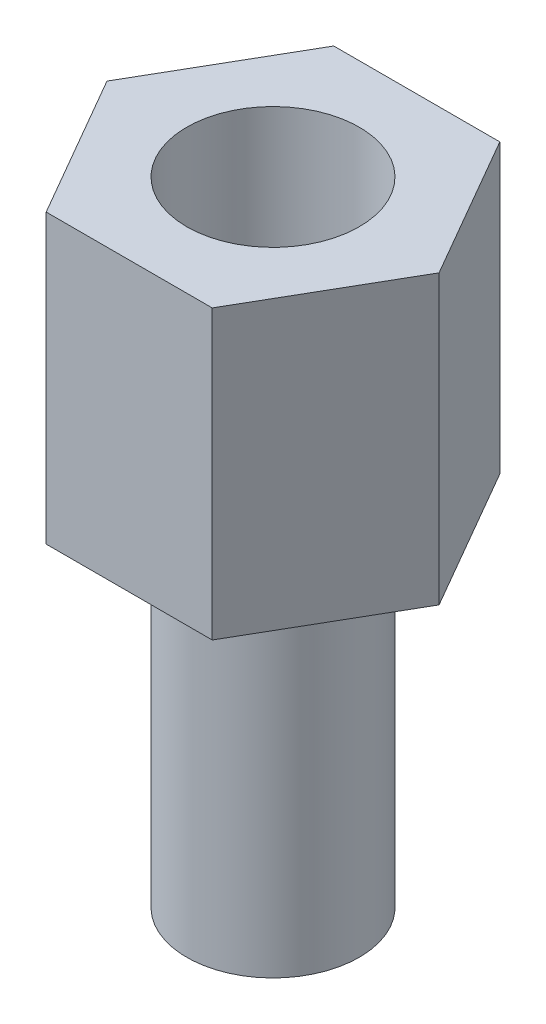
ISO-10303-21;
HEADER;
FILE_DESCRIPTION(('STEP AP214'),'2;1');
FILE_NAME('part.step','',(''),(''),'','','');
FILE_SCHEMA(('AUTOMOTIVE_DESIGN { 1 0 10303 214 1 1 1 1 }'));
ENDSEC;
DATA;
#1=APPLICATION_CONTEXT('core data for automotive mechanical design processes');
#2=APPLICATION_PROTOCOL_DEFINITION('international standard','automotive_design',2000,#1);
#3=PRODUCT_CONTEXT('',#1,'mechanical');
#4=PRODUCT('Part','Part','',(#3));
#5=PRODUCT_RELATED_PRODUCT_CATEGORY('part','',(#4));
#6=PRODUCT_DEFINITION_FORMATION('','',#4);
#7=PRODUCT_DEFINITION_CONTEXT('part definition',#1,'design');
#8=PRODUCT_DEFINITION('design','',#6,#7);
#9=PRODUCT_DEFINITION_SHAPE('','',#8);
#10=(LENGTH_UNIT() NAMED_UNIT(*) SI_UNIT(.MILLI.,.METRE.));
#11=(NAMED_UNIT(*) PLANE_ANGLE_UNIT() SI_UNIT($,.RADIAN.));
#12=(NAMED_UNIT(*) SI_UNIT($,.STERADIAN.) SOLID_ANGLE_UNIT());
#13=UNCERTAINTY_MEASURE_WITH_UNIT(LENGTH_MEASURE(1.E-05),#10,'distance_accuracy_value','');
#14=(GEOMETRIC_REPRESENTATION_CONTEXT(3) GLOBAL_UNCERTAINTY_ASSIGNED_CONTEXT((#13)) GLOBAL_UNIT_ASSIGNED_CONTEXT((#10,
#11,#12)) REPRESENTATION_CONTEXT('',''));
#15=CARTESIAN_POINT('',(0.,0.,0.));
#16=DIRECTION('',(0.,0.,1.));
#17=DIRECTION('',(1.,0.,0.));
#18=AXIS2_PLACEMENT_3D('',#15,#16,#17);
#19=CARTESIAN_POINT('',(0.,-6.,0.));
#20=DIRECTION('',(0.,1.,0.));
#21=DIRECTION('',(0.,0.,1.));
#22=AXIS2_PLACEMENT_3D('',#19,#20,#21);
#23=CYLINDRICAL_SURFACE('',#22,1.5);
#24=CARTESIAN_POINT('',(0.,-6.,0.));
#25=DIRECTION('',(0.,-1.,0.));
#26=DIRECTION('',(0.,0.,-1.));
#27=AXIS2_PLACEMENT_3D('',#24,#25,#26);
#28=CIRCLE('',#27,1.5);
#29=CARTESIAN_POINT('',(0.,-6.,-1.5));
#30=VERTEX_POINT('',#29);
#31=EDGE_CURVE('E11',#30,#30,#28,.T.);
#32=ORIENTED_EDGE('',*,*,#31,.F.);
#33=EDGE_LOOP('',(#32));
#34=FACE_BOUND('',#33,.T.);
#35=CARTESIAN_POINT('',(0.,0.,0.));
#36=DIRECTION('',(0.,-1.,0.));
#37=DIRECTION('',(0.,0.,-1.));
#38=AXIS2_PLACEMENT_3D('',#35,#36,#37);
#39=CIRCLE('',#38,1.5);
#40=CARTESIAN_POINT('',(0.,0.,-1.5));
#41=VERTEX_POINT('',#40);
#42=EDGE_CURVE('E44',#41,#41,#39,.T.);
#43=ORIENTED_EDGE('',*,*,#42,.T.);
#44=EDGE_LOOP('',(#43));
#45=FACE_BOUND('',#44,.T.);
#46=ADVANCED_FACE('F41',(#34,#45),#23,.T.);
#47=CARTESIAN_POINT('',(0.,-6.,0.));
#48=DIRECTION('',(0.,-1.,0.));
#49=DIRECTION('',(0.,0.,-1.));
#50=AXIS2_PLACEMENT_3D('',#47,#48,#49);
#51=PLANE('',#50);
#52=ORIENTED_EDGE('',*,*,#31,.T.);
#53=EDGE_LOOP('',(#52));
#54=FACE_BOUND('',#53,.T.);
#55=ADVANCED_FACE('F56',(#54),#51,.T.);
#56=CARTESIAN_POINT('',(0.,0.,0.));
#57=DIRECTION('',(0.,-1.,0.));
#58=DIRECTION('',(0.,0.,-1.));
#59=AXIS2_PLACEMENT_3D('',#56,#57,#58);
#60=PLANE('',#59);
#61=ORIENTED_EDGE('',*,*,#42,.F.);
#62=EDGE_LOOP('',(#61));
#63=FACE_BOUND('',#62,.T.);
#64=ADVANCED_FACE('F54',(#63),#60,.F.);
#65=CLOSED_SHELL('',(#46,#55,#64));
#66=MANIFOLD_SOLID_BREP('B2',#65);
#67=CARTESIAN_POINT('',(0.,5.,0.));
#68=DIRECTION('',(0.,1.,0.));
#69=DIRECTION('',(0.,0.,1.));
#70=AXIS2_PLACEMENT_3D('',#67,#68,#69);
#71=PLANE('',#70);
#72=DIRECTION('',(1.,0.,0.));
#73=VECTOR('',#72,1.);
#74=CARTESIAN_POINT('',(-1.44337567297405,5.,2.5));
#75=LINE('',#74,#73);
#76=CARTESIAN_POINT('',(-1.44337567297405,5.,2.5));
#77=VERTEX_POINT('',#76);
#78=CARTESIAN_POINT('',(1.44337567297408,5.,2.5));
#79=VERTEX_POINT('',#78);
#80=EDGE_CURVE('E178',#77,#79,#75,.T.);
#81=ORIENTED_EDGE('',*,*,#80,.T.);
#82=DIRECTION('',(0.500000000000001,0.,-0.866025403784438));
#83=VECTOR('',#82,1.);
#84=CARTESIAN_POINT('',(1.44337567297408,5.,2.5));
#85=LINE('',#84,#83);
#86=CARTESIAN_POINT('',(2.88675134594815,5.,0.));
#87=VERTEX_POINT('',#86);
#88=EDGE_CURVE('E136',#79,#87,#85,.T.);
#89=ORIENTED_EDGE('',*,*,#88,.T.);
#90=DIRECTION('',(-0.500000000000001,0.,-0.866025403784438));
#91=VECTOR('',#90,1.);
#92=CARTESIAN_POINT('',(2.88675134594815,5.,0.));
#93=LINE('',#92,#91);
#94=CARTESIAN_POINT('',(1.44337567297408,5.,-2.50000000000001));
#95=VERTEX_POINT('',#94);
#96=EDGE_CURVE('E149',#87,#95,#93,.T.);
#97=ORIENTED_EDGE('',*,*,#96,.T.);
#98=DIRECTION('',(-1.,0.,0.));
#99=VECTOR('',#98,1.);
#100=CARTESIAN_POINT('',(1.44337567297408,5.,-2.50000000000001));
#101=LINE('',#100,#99);
#102=CARTESIAN_POINT('',(-1.44337567297405,5.,-2.50000000000001));
#103=VERTEX_POINT('',#102);
#104=EDGE_CURVE('E143',#95,#103,#101,.T.);
#105=ORIENTED_EDGE('',*,*,#104,.T.);
#106=DIRECTION('',(-0.5,0.,0.866025403784438));
#107=VECTOR('',#106,1.);
#108=CARTESIAN_POINT('',(-1.44337567297405,5.,-2.50000000000001));
#109=LINE('',#108,#107);
#110=CARTESIAN_POINT('',(-2.88675134594812,5.,0.));
#111=VERTEX_POINT('',#110);
#112=EDGE_CURVE('E147',#103,#111,#109,.T.);
#113=ORIENTED_EDGE('',*,*,#112,.T.);
#114=DIRECTION('',(0.5,0.,0.866025403784438));
#115=VECTOR('',#114,1.);
#116=CARTESIAN_POINT('',(-2.88675134594812,5.,0.));
#117=LINE('',#116,#115);
#118=EDGE_CURVE('E99',#111,#77,#117,.T.);
#119=ORIENTED_EDGE('',*,*,#118,.T.);
#120=EDGE_LOOP('',(#81,#89,#97,#105,#113,#119));
#121=FACE_BOUND('',#120,.T.);
#122=CARTESIAN_POINT('',(0.,5.,0.));
#123=DIRECTION('',(0.,1.,0.));
#124=DIRECTION('',(0.,0.,1.));
#125=AXIS2_PLACEMENT_3D('',#122,#123,#124);
#126=CIRCLE('',#125,1.5);
#127=CARTESIAN_POINT('',(0.,5.,1.5));
#128=VERTEX_POINT('',#127);
#129=EDGE_CURVE('E171',#128,#128,#126,.T.);
#130=ORIENTED_EDGE('',*,*,#129,.F.);
#131=EDGE_LOOP('',(#130));
#132=FACE_BOUND('',#131,.T.);
#133=ADVANCED_FACE('F82',(#121,#132),#71,.T.);
#134=CARTESIAN_POINT('',(0.,0.,0.));
#135=DIRECTION('',(0.,1.,0.));
#136=DIRECTION('',(0.,0.,1.));
#137=AXIS2_PLACEMENT_3D('',#134,#135,#136);
#138=PLANE('',#137);
#139=DIRECTION('',(1.,0.,0.));
#140=VECTOR('',#139,1.);
#141=CARTESIAN_POINT('',(-1.44337567297405,0.,2.5));
#142=LINE('',#141,#140);
#143=CARTESIAN_POINT('',(-1.44337567297405,0.,2.5));
#144=VERTEX_POINT('',#143);
#145=CARTESIAN_POINT('',(1.44337567297408,0.,2.5));
#146=VERTEX_POINT('',#145);
#147=EDGE_CURVE('E167',#144,#146,#142,.T.);
#148=ORIENTED_EDGE('',*,*,#147,.F.);
#149=DIRECTION('',(0.5,0.,0.866025403784438));
#150=VECTOR('',#149,1.);
#151=CARTESIAN_POINT('',(-2.88675134594812,0.,0.));
#152=LINE('',#151,#150);
#153=CARTESIAN_POINT('',(-2.88675134594812,0.,0.));
#154=VERTEX_POINT('',#153);
#155=EDGE_CURVE('E128',#154,#144,#152,.T.);
#156=ORIENTED_EDGE('',*,*,#155,.F.);
#157=DIRECTION('',(-0.5,0.,0.866025403784438));
#158=VECTOR('',#157,1.);
#159=CARTESIAN_POINT('',(-1.44337567297405,0.,-2.50000000000001));
#160=LINE('',#159,#158);
#161=CARTESIAN_POINT('',(-1.44337567297405,0.,-2.50000000000001));
#162=VERTEX_POINT('',#161);
#163=EDGE_CURVE('E122',#162,#154,#160,.T.);
#164=ORIENTED_EDGE('',*,*,#163,.F.);
#165=DIRECTION('',(-1.,0.,0.));
#166=VECTOR('',#165,1.);
#167=CARTESIAN_POINT('',(1.44337567297408,0.,-2.50000000000001));
#168=LINE('',#167,#166);
#169=CARTESIAN_POINT('',(1.44337567297408,0.,-2.50000000000001));
#170=VERTEX_POINT('',#169);
#171=EDGE_CURVE('E157',#170,#162,#168,.T.);
#172=ORIENTED_EDGE('',*,*,#171,.F.);
#173=DIRECTION('',(-0.500000000000001,0.,-0.866025403784438));
#174=VECTOR('',#173,1.);
#175=CARTESIAN_POINT('',(2.88675134594815,0.,0.));
#176=LINE('',#175,#174);
#177=CARTESIAN_POINT('',(2.88675134594815,0.,0.));
#178=VERTEX_POINT('',#177);
#179=EDGE_CURVE('E173',#178,#170,#176,.T.);
#180=ORIENTED_EDGE('',*,*,#179,.F.);
#181=DIRECTION('',(0.500000000000001,0.,-0.866025403784438));
#182=VECTOR('',#181,1.);
#183=CARTESIAN_POINT('',(1.44337567297408,0.,2.5));
#184=LINE('',#183,#182);
#185=EDGE_CURVE('E170',#146,#178,#184,.T.);
#186=ORIENTED_EDGE('',*,*,#185,.F.);
#187=EDGE_LOOP('',(#148,#156,#164,#172,#180,#186));
#188=FACE_BOUND('',#187,.T.);
#189=CARTESIAN_POINT('',(0.,0.,0.));
#190=DIRECTION('',(0.,1.,0.));
#191=DIRECTION('',(0.,0.,1.));
#192=AXIS2_PLACEMENT_3D('',#189,#190,#191);
#193=CIRCLE('',#192,1.5);
#194=CARTESIAN_POINT('',(0.,0.,1.5));
#195=VERTEX_POINT('',#194);
#196=EDGE_CURVE('E271',#195,#195,#193,.T.);
#197=ORIENTED_EDGE('',*,*,#196,.T.);
#198=EDGE_LOOP('',(#197));
#199=FACE_BOUND('',#198,.T.);
#200=ADVANCED_FACE('F187',(#188,#199),#138,.F.);
#201=CARTESIAN_POINT('',(-1.44337567297405,5.,2.5));
#202=DIRECTION('',(0.,0.,-1.));
#203=DIRECTION('',(-1.,0.,0.));
#204=AXIS2_PLACEMENT_3D('',#201,#202,#203);
#205=PLANE('',#204);
#206=ORIENTED_EDGE('',*,*,#147,.T.);
#207=DIRECTION('',(0.,-1.,0.));
#208=VECTOR('',#207,1.);
#209=CARTESIAN_POINT('',(1.44337567297408,5.,2.5));
#210=LINE('',#209,#208);
#211=EDGE_CURVE('E39',#79,#146,#210,.T.);
#212=ORIENTED_EDGE('',*,*,#211,.F.);
#213=ORIENTED_EDGE('',*,*,#80,.F.);
#214=DIRECTION('',(0.,-1.,0.));
#215=VECTOR('',#214,1.);
#216=CARTESIAN_POINT('',(-1.44337567297405,5.,2.5));
#217=LINE('',#216,#215);
#218=EDGE_CURVE('E163',#77,#144,#217,.T.);
#219=ORIENTED_EDGE('',*,*,#218,.T.);
#220=EDGE_LOOP('',(#206,#212,#213,#219));
#221=FACE_BOUND('',#220,.T.);
#222=ADVANCED_FACE('F84',(#221),#205,.F.);
#223=CARTESIAN_POINT('',(1.44337567297408,5.,2.5));
#224=DIRECTION('',(-0.866025403784438,0.,-0.500000000000001));
#225=DIRECTION('',(-0.500000000000001,0.,0.866025403784438));
#226=AXIS2_PLACEMENT_3D('',#223,#224,#225);
#227=PLANE('',#226);
#228=ORIENTED_EDGE('',*,*,#185,.T.);
#229=DIRECTION('',(0.,-1.,0.));
#230=VECTOR('',#229,1.);
#231=CARTESIAN_POINT('',(2.88675134594815,5.,0.));
#232=LINE('',#231,#230);
#233=EDGE_CURVE('E91',#87,#178,#232,.T.);
#234=ORIENTED_EDGE('',*,*,#233,.F.);
#235=ORIENTED_EDGE('',*,*,#88,.F.);
#236=ORIENTED_EDGE('',*,*,#211,.T.);
#237=EDGE_LOOP('',(#228,#234,#235,#236));
#238=FACE_BOUND('',#237,.T.);
#239=ADVANCED_FACE('F212',(#238),#227,.F.);
#240=CARTESIAN_POINT('',(2.88675134594815,5.,0.));
#241=DIRECTION('',(-0.866025403784438,0.,0.500000000000001));
#242=DIRECTION('',(0.500000000000001,0.,0.866025403784438));
#243=AXIS2_PLACEMENT_3D('',#240,#241,#242);
#244=PLANE('',#243);
#245=ORIENTED_EDGE('',*,*,#179,.T.);
#246=DIRECTION('',(0.,-1.,0.));
#247=VECTOR('',#246,1.);
#248=CARTESIAN_POINT('',(1.44337567297408,5.,-2.50000000000001));
#249=LINE('',#248,#247);
#250=EDGE_CURVE('E158',#95,#170,#249,.T.);
#251=ORIENTED_EDGE('',*,*,#250,.F.);
#252=ORIENTED_EDGE('',*,*,#96,.F.);
#253=ORIENTED_EDGE('',*,*,#233,.T.);
#254=EDGE_LOOP('',(#245,#251,#252,#253));
#255=FACE_BOUND('',#254,.T.);
#256=ADVANCED_FACE('F184',(#255),#244,.F.);
#257=CARTESIAN_POINT('',(1.44337567297408,5.,-2.50000000000001));
#258=DIRECTION('',(0.,0.,1.));
#259=DIRECTION('',(1.,0.,0.));
#260=AXIS2_PLACEMENT_3D('',#257,#258,#259);
#261=PLANE('',#260);
#262=ORIENTED_EDGE('',*,*,#171,.T.);
#263=DIRECTION('',(0.,-1.,0.));
#264=VECTOR('',#263,1.);
#265=CARTESIAN_POINT('',(-1.44337567297405,5.,-2.50000000000001));
#266=LINE('',#265,#264);
#267=EDGE_CURVE('E154',#103,#162,#266,.T.);
#268=ORIENTED_EDGE('',*,*,#267,.F.);
#269=ORIENTED_EDGE('',*,*,#104,.F.);
#270=ORIENTED_EDGE('',*,*,#250,.T.);
#271=EDGE_LOOP('',(#262,#268,#269,#270));
#272=FACE_BOUND('',#271,.T.);
#273=ADVANCED_FACE('F155',(#272),#261,.F.);
#274=CARTESIAN_POINT('',(-1.44337567297405,5.,-2.50000000000001));
#275=DIRECTION('',(0.866025403784439,0.,0.5));
#276=DIRECTION('',(0.5,0.,-0.866025403784439));
#277=AXIS2_PLACEMENT_3D('',#274,#275,#276);
#278=PLANE('',#277);
#279=ORIENTED_EDGE('',*,*,#163,.T.);
#280=DIRECTION('',(0.,-1.,0.));
#281=VECTOR('',#280,1.);
#282=CARTESIAN_POINT('',(-2.88675134594812,5.,0.));
#283=LINE('',#282,#281);
#284=EDGE_CURVE('E159',#111,#154,#283,.T.);
#285=ORIENTED_EDGE('',*,*,#284,.F.);
#286=ORIENTED_EDGE('',*,*,#112,.F.);
#287=ORIENTED_EDGE('',*,*,#267,.T.);
#288=EDGE_LOOP('',(#279,#285,#286,#287));
#289=FACE_BOUND('',#288,.T.);
#290=ADVANCED_FACE('F161',(#289),#278,.F.);
#291=CARTESIAN_POINT('',(-2.88675134594812,5.,0.));
#292=DIRECTION('',(0.866025403784438,0.,-0.5));
#293=DIRECTION('',(-0.5,0.,-0.866025403784438));
#294=AXIS2_PLACEMENT_3D('',#291,#292,#293);
#295=PLANE('',#294);
#296=ORIENTED_EDGE('',*,*,#155,.T.);
#297=ORIENTED_EDGE('',*,*,#218,.F.);
#298=ORIENTED_EDGE('',*,*,#118,.F.);
#299=ORIENTED_EDGE('',*,*,#284,.T.);
#300=EDGE_LOOP('',(#296,#297,#298,#299));
#301=FACE_BOUND('',#300,.T.);
#302=ADVANCED_FACE('F192',(#301),#295,.F.);
#303=CARTESIAN_POINT('',(0.,5.,0.));
#304=DIRECTION('',(0.,-1.,0.));
#305=DIRECTION('',(0.,0.,-1.));
#306=AXIS2_PLACEMENT_3D('',#303,#304,#305);
#307=CYLINDRICAL_SURFACE('',#306,1.5);
#308=ORIENTED_EDGE('',*,*,#129,.T.);
#309=EDGE_LOOP('',(#308));
#310=FACE_BOUND('',#309,.T.);
#311=ORIENTED_EDGE('',*,*,#196,.F.);
#312=EDGE_LOOP('',(#311));
#313=FACE_BOUND('',#312,.T.);
#314=ADVANCED_FACE('F194',(#310,#313),#307,.F.);
#315=CLOSED_SHELL('',(#133,#200,#222,#239,#256,#273,#290,#302,#314));
#316=MANIFOLD_SOLID_BREP('B6',#315);
#317=ADVANCED_BREP_SHAPE_REPRESENTATION('',(#18,#66,#316),#14);
#318=SHAPE_DEFINITION_REPRESENTATION(#9,#317);
ENDSEC;
END-ISO-10303-21;
